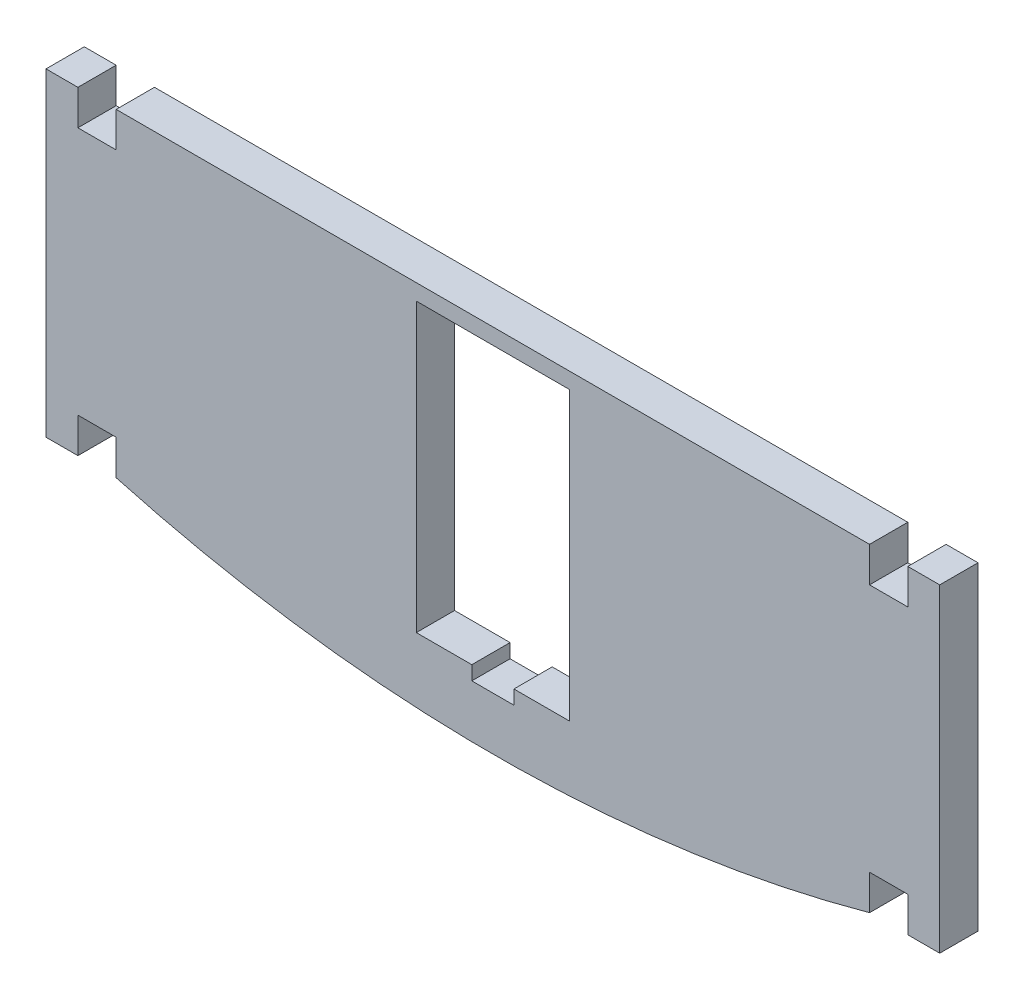
ISO-10303-21;
HEADER;
FILE_DESCRIPTION(('STEP AP214'),'2;1');
FILE_NAME('part.step','',(''),(''),'','','');
FILE_SCHEMA(('AUTOMOTIVE_DESIGN { 1 0 10303 214 1 1 1 1 }'));
ENDSEC;
DATA;
#1=APPLICATION_CONTEXT('core data for automotive mechanical design processes');
#2=APPLICATION_PROTOCOL_DEFINITION('international standard','automotive_design',2000,#1);
#3=PRODUCT_CONTEXT('',#1,'mechanical');
#4=PRODUCT('Part','Part','',(#3));
#5=PRODUCT_RELATED_PRODUCT_CATEGORY('part','',(#4));
#6=PRODUCT_DEFINITION_FORMATION('','',#4);
#7=PRODUCT_DEFINITION_CONTEXT('part definition',#1,'design');
#8=PRODUCT_DEFINITION('design','',#6,#7);
#9=PRODUCT_DEFINITION_SHAPE('','',#8);
#10=(LENGTH_UNIT() NAMED_UNIT(*) SI_UNIT(.MILLI.,.METRE.));
#11=(NAMED_UNIT(*) PLANE_ANGLE_UNIT() SI_UNIT($,.RADIAN.));
#12=(NAMED_UNIT(*) SI_UNIT($,.STERADIAN.) SOLID_ANGLE_UNIT());
#13=UNCERTAINTY_MEASURE_WITH_UNIT(LENGTH_MEASURE(1.E-05),#10,'distance_accuracy_value','');
#14=(GEOMETRIC_REPRESENTATION_CONTEXT(3) GLOBAL_UNCERTAINTY_ASSIGNED_CONTEXT((#13)) GLOBAL_UNIT_ASSIGNED_CONTEXT((#10,
#11,#12)) REPRESENTATION_CONTEXT('',''));
#15=CARTESIAN_POINT('',(0.,0.,0.));
#16=DIRECTION('',(0.,0.,1.));
#17=DIRECTION('',(1.,0.,0.));
#18=AXIS2_PLACEMENT_3D('',#15,#16,#17);
#19=CARTESIAN_POINT('',(-5.99999999999999,-11.25,-3.));
#20=DIRECTION('',(0.,1.,0.));
#21=DIRECTION('',(-1.,0.,0.));
#22=AXIS2_PLACEMENT_3D('',#19,#20,#21);
#23=PLANE('',#22);
#24=DIRECTION('',(0.,0.,1.));
#25=VECTOR('',#24,1.);
#26=CARTESIAN_POINT('',(-1.65,-11.25,-10.));
#27=LINE('',#26,#25);
#28=CARTESIAN_POINT('',(-1.65,-11.25,-3.));
#29=VERTEX_POINT('',#28);
#30=CARTESIAN_POINT('',(-1.65,-11.25,0.));
#31=VERTEX_POINT('',#30);
#32=EDGE_CURVE('E523',#29,#31,#27,.T.);
#33=ORIENTED_EDGE('',*,*,#32,.F.);
#34=DIRECTION('',(-1.,0.,0.));
#35=VECTOR('',#34,1.);
#36=CARTESIAN_POINT('',(-5.99999999999999,-11.25,-3.));
#37=LINE('',#36,#35);
#38=CARTESIAN_POINT('',(-5.99999999999999,-11.25,-3.));
#39=VERTEX_POINT('',#38);
#40=EDGE_CURVE('E60',#29,#39,#37,.T.);
#41=ORIENTED_EDGE('',*,*,#40,.T.);
#42=DIRECTION('',(0.,0.,1.));
#43=VECTOR('',#42,1.);
#44=CARTESIAN_POINT('',(-5.99999999999999,-11.25,-3.));
#45=LINE('',#44,#43);
#46=CARTESIAN_POINT('',(-5.99999999999999,-11.25,0.));
#47=VERTEX_POINT('',#46);
#48=EDGE_CURVE('E11',#39,#47,#45,.T.);
#49=ORIENTED_EDGE('',*,*,#48,.T.);
#50=DIRECTION('',(-1.,0.,0.));
#51=VECTOR('',#50,1.);
#52=CARTESIAN_POINT('',(-5.99999999999999,-11.25,0.));
#53=LINE('',#52,#51);
#54=EDGE_CURVE('E103',#31,#47,#53,.T.);
#55=ORIENTED_EDGE('',*,*,#54,.F.);
#56=EDGE_LOOP('',(#33,#41,#49,#55));
#57=FACE_BOUND('',#56,.T.);
#58=ADVANCED_FACE('F35',(#57),#23,.T.);
#59=CARTESIAN_POINT('',(-5.99999999999999,11.25,-3.));
#60=DIRECTION('',(1.,0.,0.));
#61=DIRECTION('',(0.,0.,-1.));
#62=AXIS2_PLACEMENT_3D('',#59,#60,#61);
#63=PLANE('',#62);
#64=DIRECTION('',(0.,1.,0.));
#65=VECTOR('',#64,1.);
#66=CARTESIAN_POINT('',(-5.99999999999999,11.25,0.));
#67=LINE('',#66,#65);
#68=CARTESIAN_POINT('',(-5.99999999999999,11.25,0.));
#69=VERTEX_POINT('',#68);
#70=EDGE_CURVE('E173',#47,#69,#67,.T.);
#71=ORIENTED_EDGE('',*,*,#70,.F.);
#72=ORIENTED_EDGE('',*,*,#48,.F.);
#73=DIRECTION('',(0.,1.,0.));
#74=VECTOR('',#73,1.);
#75=CARTESIAN_POINT('',(-5.99999999999999,11.25,-3.));
#76=LINE('',#75,#74);
#77=CARTESIAN_POINT('',(-5.99999999999999,11.25,-3.));
#78=VERTEX_POINT('',#77);
#79=EDGE_CURVE('E208',#39,#78,#76,.T.);
#80=ORIENTED_EDGE('',*,*,#79,.T.);
#81=DIRECTION('',(0.,0.,1.));
#82=VECTOR('',#81,1.);
#83=CARTESIAN_POINT('',(-5.99999999999999,11.25,-3.));
#84=LINE('',#83,#82);
#85=EDGE_CURVE('E39',#78,#69,#84,.T.);
#86=ORIENTED_EDGE('',*,*,#85,.T.);
#87=EDGE_LOOP('',(#71,#72,#80,#86));
#88=FACE_BOUND('',#87,.T.);
#89=ADVANCED_FACE('F37',(#88),#63,.T.);
#90=DIRECTION('',(0.,0.,1.));
#91=VECTOR('',#90,1.);
#92=CARTESIAN_POINT('',(1.65,-11.25,-10.));
#93=LINE('',#92,#91);
#94=CARTESIAN_POINT('',(1.65,-11.25,-3.));
#95=VERTEX_POINT('',#94);
#96=CARTESIAN_POINT('',(1.65,-11.25,0.));
#97=VERTEX_POINT('',#96);
#98=EDGE_CURVE('E516',#95,#97,#93,.T.);
#99=ORIENTED_EDGE('',*,*,#98,.T.);
#100=CARTESIAN_POINT('',(5.99999999999999,-11.25,0.));
#101=VERTEX_POINT('',#100);
#102=EDGE_CURVE('E206',#101,#97,#53,.T.);
#103=ORIENTED_EDGE('',*,*,#102,.F.);
#104=DIRECTION('',(0.,0.,1.));
#105=VECTOR('',#104,1.);
#106=CARTESIAN_POINT('',(5.99999999999999,-11.25,-3.));
#107=LINE('',#106,#105);
#108=CARTESIAN_POINT('',(5.99999999999999,-11.25,-3.));
#109=VERTEX_POINT('',#108);
#110=EDGE_CURVE('E320',#109,#101,#107,.T.);
#111=ORIENTED_EDGE('',*,*,#110,.F.);
#112=EDGE_CURVE('E170',#109,#95,#37,.T.);
#113=ORIENTED_EDGE('',*,*,#112,.T.);
#114=EDGE_LOOP('',(#99,#103,#111,#113));
#115=FACE_BOUND('',#114,.T.);
#116=ADVANCED_FACE('F503',(#115),#23,.T.);
#117=CARTESIAN_POINT('',(0.,94.414355190673,-3.));
#118=DIRECTION('',(0.,0.,1.));
#119=DIRECTION('',(1.,0.,0.));
#120=AXIS2_PLACEMENT_3D('',#117,#118,#119);
#121=CYLINDRICAL_SURFACE('',#120,110.914355190673);
#122=CARTESIAN_POINT('',(0.,94.414355190673,0.));
#123=DIRECTION('',(0.,0.,1.));
#124=DIRECTION('',(1.,0.,0.));
#125=AXIS2_PLACEMENT_3D('',#122,#123,#124);
#126=CIRCLE('',#125,110.914355190673);
#127=CARTESIAN_POINT('',(-29.518042643871,-12.5,0.));
#128=VERTEX_POINT('',#127);
#129=CARTESIAN_POINT('',(29.518042643871,-12.5,0.));
#130=VERTEX_POINT('',#129);
#131=EDGE_CURVE('E203',#128,#130,#126,.T.);
#132=ORIENTED_EDGE('',*,*,#131,.F.);
#133=DIRECTION('',(0.,0.,1.));
#134=VECTOR('',#133,1.);
#135=CARTESIAN_POINT('',(-29.518042643871,-12.5,-3.));
#136=LINE('',#135,#134);
#137=CARTESIAN_POINT('',(-29.518042643871,-12.5,-3.));
#138=VERTEX_POINT('',#137);
#139=EDGE_CURVE('E44',#138,#128,#136,.T.);
#140=ORIENTED_EDGE('',*,*,#139,.F.);
#141=CARTESIAN_POINT('',(0.,94.414355190673,-3.));
#142=DIRECTION('',(0.,0.,1.));
#143=DIRECTION('',(1.,0.,0.));
#144=AXIS2_PLACEMENT_3D('',#141,#142,#143);
#145=CIRCLE('',#144,110.914355190673);
#146=CARTESIAN_POINT('',(29.518042643871,-12.5,-3.));
#147=VERTEX_POINT('',#146);
#148=EDGE_CURVE('E160',#138,#147,#145,.T.);
#149=ORIENTED_EDGE('',*,*,#148,.T.);
#150=DIRECTION('',(0.,0.,1.));
#151=VECTOR('',#150,1.);
#152=CARTESIAN_POINT('',(29.518042643871,-12.5,-3.));
#153=LINE('',#152,#151);
#154=EDGE_CURVE('E313',#147,#130,#153,.T.);
#155=ORIENTED_EDGE('',*,*,#154,.T.);
#156=EDGE_LOOP('',(#132,#140,#149,#155));
#157=FACE_BOUND('',#156,.T.);
#158=ADVANCED_FACE('F319',(#157),#121,.T.);
#159=CARTESIAN_POINT('',(-29.5180426438709,-9.75,-3.));
#160=DIRECTION('',(-1.,0.,0.));
#161=DIRECTION('',(0.,-1.,0.));
#162=AXIS2_PLACEMENT_3D('',#159,#160,#161);
#163=PLANE('',#162);
#164=DIRECTION('',(0.,-1.,0.));
#165=VECTOR('',#164,1.);
#166=CARTESIAN_POINT('',(-29.5180426438709,-9.75,0.));
#167=LINE('',#166,#165);
#168=CARTESIAN_POINT('',(-29.5180426438709,-9.75,0.));
#169=VERTEX_POINT('',#168);
#170=EDGE_CURVE('E143',#169,#128,#167,.T.);
#171=ORIENTED_EDGE('',*,*,#170,.F.);
#172=DIRECTION('',(0.,0.,1.));
#173=VECTOR('',#172,1.);
#174=CARTESIAN_POINT('',(-29.5180426438709,-9.75,-3.));
#175=LINE('',#174,#173);
#176=CARTESIAN_POINT('',(-29.5180426438709,-9.75,-3.));
#177=VERTEX_POINT('',#176);
#178=EDGE_CURVE('E138',#177,#169,#175,.T.);
#179=ORIENTED_EDGE('',*,*,#178,.F.);
#180=DIRECTION('',(0.,-1.,0.));
#181=VECTOR('',#180,1.);
#182=CARTESIAN_POINT('',(-29.5180426438709,-9.75,-3.));
#183=LINE('',#182,#181);
#184=EDGE_CURVE('E141',#177,#138,#183,.T.);
#185=ORIENTED_EDGE('',*,*,#184,.T.);
#186=ORIENTED_EDGE('',*,*,#139,.T.);
#187=EDGE_LOOP('',(#171,#179,#185,#186));
#188=FACE_BOUND('',#187,.T.);
#189=ADVANCED_FACE('F140',(#188),#163,.T.);
#190=CARTESIAN_POINT('',(-32.5180426438709,-9.75,-3.));
#191=DIRECTION('',(0.,-1.,0.));
#192=DIRECTION('',(0.,0.,-1.));
#193=AXIS2_PLACEMENT_3D('',#190,#191,#192);
#194=PLANE('',#193);
#195=DIRECTION('',(1.,0.,0.));
#196=VECTOR('',#195,1.);
#197=CARTESIAN_POINT('',(-32.5180426438709,-9.75,0.));
#198=LINE('',#197,#196);
#199=CARTESIAN_POINT('',(-32.5180426438709,-9.75,0.));
#200=VERTEX_POINT('',#199);
#201=EDGE_CURVE('E200',#200,#169,#198,.T.);
#202=ORIENTED_EDGE('',*,*,#201,.F.);
#203=DIRECTION('',(0.,0.,1.));
#204=VECTOR('',#203,1.);
#205=CARTESIAN_POINT('',(-32.5180426438709,-9.75,-3.));
#206=LINE('',#205,#204);
#207=CARTESIAN_POINT('',(-32.5180426438709,-9.75,-3.));
#208=VERTEX_POINT('',#207);
#209=EDGE_CURVE('E148',#208,#200,#206,.T.);
#210=ORIENTED_EDGE('',*,*,#209,.F.);
#211=DIRECTION('',(1.,0.,0.));
#212=VECTOR('',#211,1.);
#213=CARTESIAN_POINT('',(-32.5180426438709,-9.75,-3.));
#214=LINE('',#213,#212);
#215=EDGE_CURVE('E156',#208,#177,#214,.T.);
#216=ORIENTED_EDGE('',*,*,#215,.T.);
#217=ORIENTED_EDGE('',*,*,#178,.T.);
#218=EDGE_LOOP('',(#202,#210,#216,#217));
#219=FACE_BOUND('',#218,.T.);
#220=ADVANCED_FACE('F162',(#219),#194,.T.);
#221=CARTESIAN_POINT('',(-32.5180426438709,-12.5,-3.));
#222=DIRECTION('',(1.,0.,0.));
#223=DIRECTION('',(0.,0.,-1.));
#224=AXIS2_PLACEMENT_3D('',#221,#222,#223);
#225=PLANE('',#224);
#226=DIRECTION('',(0.,1.,0.));
#227=VECTOR('',#226,1.);
#228=CARTESIAN_POINT('',(-32.5180426438709,-12.5,0.));
#229=LINE('',#228,#227);
#230=CARTESIAN_POINT('',(-32.5180426438709,-12.5,0.));
#231=VERTEX_POINT('',#230);
#232=EDGE_CURVE('E197',#231,#200,#229,.T.);
#233=ORIENTED_EDGE('',*,*,#232,.F.);
#234=DIRECTION('',(0.,0.,1.));
#235=VECTOR('',#234,1.);
#236=CARTESIAN_POINT('',(-32.5180426438709,-12.5,-3.));
#237=LINE('',#236,#235);
#238=CARTESIAN_POINT('',(-32.5180426438709,-12.5,-3.));
#239=VERTEX_POINT('',#238);
#240=EDGE_CURVE('E212',#239,#231,#237,.T.);
#241=ORIENTED_EDGE('',*,*,#240,.F.);
#242=DIRECTION('',(0.,1.,0.));
#243=VECTOR('',#242,1.);
#244=CARTESIAN_POINT('',(-32.5180426438709,-12.5,-3.));
#245=LINE('',#244,#243);
#246=EDGE_CURVE('E163',#239,#208,#245,.T.);
#247=ORIENTED_EDGE('',*,*,#246,.T.);
#248=ORIENTED_EDGE('',*,*,#209,.T.);
#249=EDGE_LOOP('',(#233,#241,#247,#248));
#250=FACE_BOUND('',#249,.T.);
#251=ADVANCED_FACE('F295',(#250),#225,.T.);
#252=CARTESIAN_POINT('',(-35.0180426438709,-12.5,-3.));
#253=DIRECTION('',(0.,-1.,0.));
#254=DIRECTION('',(0.,0.,-1.));
#255=AXIS2_PLACEMENT_3D('',#252,#253,#254);
#256=PLANE('',#255);
#257=DIRECTION('',(1.,0.,0.));
#258=VECTOR('',#257,1.);
#259=CARTESIAN_POINT('',(-35.0180426438709,-12.5,0.));
#260=LINE('',#259,#258);
#261=CARTESIAN_POINT('',(-35.0180426438709,-12.5,0.));
#262=VERTEX_POINT('',#261);
#263=EDGE_CURVE('E194',#262,#231,#260,.T.);
#264=ORIENTED_EDGE('',*,*,#263,.F.);
#265=DIRECTION('',(0.,0.,1.));
#266=VECTOR('',#265,1.);
#267=CARTESIAN_POINT('',(-35.0180426438709,-12.5,-3.));
#268=LINE('',#267,#266);
#269=CARTESIAN_POINT('',(-35.0180426438709,-12.5,-3.));
#270=VERTEX_POINT('',#269);
#271=EDGE_CURVE('E214',#270,#262,#268,.T.);
#272=ORIENTED_EDGE('',*,*,#271,.F.);
#273=DIRECTION('',(1.,0.,0.));
#274=VECTOR('',#273,1.);
#275=CARTESIAN_POINT('',(-35.0180426438709,-12.5,-3.));
#276=LINE('',#275,#274);
#277=EDGE_CURVE('E165',#270,#239,#276,.T.);
#278=ORIENTED_EDGE('',*,*,#277,.T.);
#279=ORIENTED_EDGE('',*,*,#240,.T.);
#280=EDGE_LOOP('',(#264,#272,#278,#279));
#281=FACE_BOUND('',#280,.T.);
#282=ADVANCED_FACE('F291',(#281),#256,.T.);
#283=CARTESIAN_POINT('',(-35.0180426438709,12.5,-3.));
#284=DIRECTION('',(-1.,0.,0.));
#285=DIRECTION('',(0.,0.,1.));
#286=AXIS2_PLACEMENT_3D('',#283,#284,#285);
#287=PLANE('',#286);
#288=DIRECTION('',(0.,-1.,0.));
#289=VECTOR('',#288,1.);
#290=CARTESIAN_POINT('',(-35.0180426438709,12.5,0.));
#291=LINE('',#290,#289);
#292=CARTESIAN_POINT('',(-35.0180426438709,12.5,0.));
#293=VERTEX_POINT('',#292);
#294=EDGE_CURVE('E191',#293,#262,#291,.T.);
#295=ORIENTED_EDGE('',*,*,#294,.F.);
#296=DIRECTION('',(0.,0.,1.));
#297=VECTOR('',#296,1.);
#298=CARTESIAN_POINT('',(-35.0180426438709,12.5,-3.));
#299=LINE('',#298,#297);
#300=CARTESIAN_POINT('',(-35.0180426438709,12.5,-3.));
#301=VERTEX_POINT('',#300);
#302=EDGE_CURVE('E216',#301,#293,#299,.T.);
#303=ORIENTED_EDGE('',*,*,#302,.F.);
#304=DIRECTION('',(0.,-1.,0.));
#305=VECTOR('',#304,1.);
#306=CARTESIAN_POINT('',(-35.0180426438709,12.5,-3.));
#307=LINE('',#306,#305);
#308=EDGE_CURVE('E337',#301,#270,#307,.T.);
#309=ORIENTED_EDGE('',*,*,#308,.T.);
#310=ORIENTED_EDGE('',*,*,#271,.T.);
#311=EDGE_LOOP('',(#295,#303,#309,#310));
#312=FACE_BOUND('',#311,.T.);
#313=ADVANCED_FACE('F287',(#312),#287,.T.);
#314=CARTESIAN_POINT('',(-32.5180426438709,12.5,-3.));
#315=DIRECTION('',(0.,1.,0.));
#316=DIRECTION('',(0.,0.,1.));
#317=AXIS2_PLACEMENT_3D('',#314,#315,#316);
#318=PLANE('',#317);
#319=DIRECTION('',(-1.,0.,0.));
#320=VECTOR('',#319,1.);
#321=CARTESIAN_POINT('',(-32.5180426438709,12.5,0.));
#322=LINE('',#321,#320);
#323=CARTESIAN_POINT('',(-32.5180426438709,12.5,0.));
#324=VERTEX_POINT('',#323);
#325=EDGE_CURVE('E188',#324,#293,#322,.T.);
#326=ORIENTED_EDGE('',*,*,#325,.F.);
#327=DIRECTION('',(0.,0.,1.));
#328=VECTOR('',#327,1.);
#329=CARTESIAN_POINT('',(-32.5180426438709,12.5,-3.));
#330=LINE('',#329,#328);
#331=CARTESIAN_POINT('',(-32.5180426438709,12.5,-3.));
#332=VERTEX_POINT('',#331);
#333=EDGE_CURVE('E218',#332,#324,#330,.T.);
#334=ORIENTED_EDGE('',*,*,#333,.F.);
#335=DIRECTION('',(-1.,0.,0.));
#336=VECTOR('',#335,1.);
#337=CARTESIAN_POINT('',(-32.5180426438709,12.5,-3.));
#338=LINE('',#337,#336);
#339=EDGE_CURVE('E283',#332,#301,#338,.T.);
#340=ORIENTED_EDGE('',*,*,#339,.T.);
#341=ORIENTED_EDGE('',*,*,#302,.T.);
#342=EDGE_LOOP('',(#326,#334,#340,#341));
#343=FACE_BOUND('',#342,.T.);
#344=ADVANCED_FACE('F281',(#343),#318,.T.);
#345=CARTESIAN_POINT('',(-32.5180426438709,9.75,-3.));
#346=DIRECTION('',(1.,0.,0.));
#347=DIRECTION('',(0.,0.,-1.));
#348=AXIS2_PLACEMENT_3D('',#345,#346,#347);
#349=PLANE('',#348);
#350=DIRECTION('',(0.,1.,0.));
#351=VECTOR('',#350,1.);
#352=CARTESIAN_POINT('',(-32.5180426438709,9.75,0.));
#353=LINE('',#352,#351);
#354=CARTESIAN_POINT('',(-32.5180426438709,9.75,0.));
#355=VERTEX_POINT('',#354);
#356=EDGE_CURVE('E185',#355,#324,#353,.T.);
#357=ORIENTED_EDGE('',*,*,#356,.F.);
#358=DIRECTION('',(0.,0.,1.));
#359=VECTOR('',#358,1.);
#360=CARTESIAN_POINT('',(-32.5180426438709,9.75,-3.));
#361=LINE('',#360,#359);
#362=CARTESIAN_POINT('',(-32.5180426438709,9.75,-3.));
#363=VERTEX_POINT('',#362);
#364=EDGE_CURVE('E220',#363,#355,#361,.T.);
#365=ORIENTED_EDGE('',*,*,#364,.F.);
#366=DIRECTION('',(0.,1.,0.));
#367=VECTOR('',#366,1.);
#368=CARTESIAN_POINT('',(-32.5180426438709,9.75,-3.));
#369=LINE('',#368,#367);
#370=EDGE_CURVE('E277',#363,#332,#369,.T.);
#371=ORIENTED_EDGE('',*,*,#370,.T.);
#372=ORIENTED_EDGE('',*,*,#333,.T.);
#373=EDGE_LOOP('',(#357,#365,#371,#372));
#374=FACE_BOUND('',#373,.T.);
#375=ADVANCED_FACE('F274',(#374),#349,.T.);
#376=CARTESIAN_POINT('',(-29.5180426438709,9.75,-3.));
#377=DIRECTION('',(0.,1.,0.));
#378=DIRECTION('',(0.,0.,1.));
#379=AXIS2_PLACEMENT_3D('',#376,#377,#378);
#380=PLANE('',#379);
#381=DIRECTION('',(-1.,0.,0.));
#382=VECTOR('',#381,1.);
#383=CARTESIAN_POINT('',(-29.5180426438709,9.75,0.));
#384=LINE('',#383,#382);
#385=CARTESIAN_POINT('',(-29.5180426438709,9.75,0.));
#386=VERTEX_POINT('',#385);
#387=EDGE_CURVE('E182',#386,#355,#384,.T.);
#388=ORIENTED_EDGE('',*,*,#387,.F.);
#389=DIRECTION('',(0.,0.,1.));
#390=VECTOR('',#389,1.);
#391=CARTESIAN_POINT('',(-29.5180426438709,9.75,-3.));
#392=LINE('',#391,#390);
#393=CARTESIAN_POINT('',(-29.5180426438709,9.75,-3.));
#394=VERTEX_POINT('',#393);
#395=EDGE_CURVE('E222',#394,#386,#392,.T.);
#396=ORIENTED_EDGE('',*,*,#395,.F.);
#397=DIRECTION('',(-1.,0.,0.));
#398=VECTOR('',#397,1.);
#399=CARTESIAN_POINT('',(-29.5180426438709,9.75,-3.));
#400=LINE('',#399,#398);
#401=EDGE_CURVE('E333',#394,#363,#400,.T.);
#402=ORIENTED_EDGE('',*,*,#401,.T.);
#403=ORIENTED_EDGE('',*,*,#364,.T.);
#404=EDGE_LOOP('',(#388,#396,#402,#403));
#405=FACE_BOUND('',#404,.T.);
#406=ADVANCED_FACE('F270',(#405),#380,.T.);
#407=CARTESIAN_POINT('',(-29.5180426438709,12.5,-3.));
#408=DIRECTION('',(-1.,0.,0.));
#409=DIRECTION('',(0.,-1.,0.));
#410=AXIS2_PLACEMENT_3D('',#407,#408,#409);
#411=PLANE('',#410);
#412=DIRECTION('',(0.,-1.,0.));
#413=VECTOR('',#412,1.);
#414=CARTESIAN_POINT('',(-29.5180426438709,12.5,0.));
#415=LINE('',#414,#413);
#416=CARTESIAN_POINT('',(-29.5180426438709,12.5,0.));
#417=VERTEX_POINT('',#416);
#418=EDGE_CURVE('E179',#417,#386,#415,.T.);
#419=ORIENTED_EDGE('',*,*,#418,.F.);
#420=DIRECTION('',(0.,0.,1.));
#421=VECTOR('',#420,1.);
#422=CARTESIAN_POINT('',(-29.5180426438709,12.5,-3.));
#423=LINE('',#422,#421);
#424=CARTESIAN_POINT('',(-29.5180426438709,12.5,-3.));
#425=VERTEX_POINT('',#424);
#426=EDGE_CURVE('E223',#425,#417,#423,.T.);
#427=ORIENTED_EDGE('',*,*,#426,.F.);
#428=DIRECTION('',(0.,-1.,0.));
#429=VECTOR('',#428,1.);
#430=CARTESIAN_POINT('',(-29.5180426438709,12.5,-3.));
#431=LINE('',#430,#429);
#432=EDGE_CURVE('E266',#425,#394,#431,.T.);
#433=ORIENTED_EDGE('',*,*,#432,.T.);
#434=ORIENTED_EDGE('',*,*,#395,.T.);
#435=EDGE_LOOP('',(#419,#427,#433,#434));
#436=FACE_BOUND('',#435,.T.);
#437=ADVANCED_FACE('F263',(#436),#411,.T.);
#438=CARTESIAN_POINT('',(-5.99999999999999,11.25,-3.));
#439=DIRECTION('',(0.,-1.,0.));
#440=DIRECTION('',(1.,0.,0.));
#441=AXIS2_PLACEMENT_3D('',#438,#439,#440);
#442=PLANE('',#441);
#443=DIRECTION('',(1.,0.,0.));
#444=VECTOR('',#443,1.);
#445=CARTESIAN_POINT('',(-5.99999999999999,11.25,0.));
#446=LINE('',#445,#444);
#447=CARTESIAN_POINT('',(5.99999999999999,11.25,0.));
#448=VERTEX_POINT('',#447);
#449=EDGE_CURVE('E175',#69,#448,#446,.T.);
#450=ORIENTED_EDGE('',*,*,#449,.F.);
#451=ORIENTED_EDGE('',*,*,#85,.F.);
#452=DIRECTION('',(1.,0.,0.));
#453=VECTOR('',#452,1.);
#454=CARTESIAN_POINT('',(-5.99999999999999,11.25,-3.));
#455=LINE('',#454,#453);
#456=CARTESIAN_POINT('',(5.99999999999999,11.25,-3.));
#457=VERTEX_POINT('',#456);
#458=EDGE_CURVE('E330',#78,#457,#455,.T.);
#459=ORIENTED_EDGE('',*,*,#458,.T.);
#460=DIRECTION('',(0.,0.,1.));
#461=VECTOR('',#460,1.);
#462=CARTESIAN_POINT('',(5.99999999999999,11.25,-3.));
#463=LINE('',#462,#461);
#464=EDGE_CURVE('E176',#457,#448,#463,.T.);
#465=ORIENTED_EDGE('',*,*,#464,.T.);
#466=EDGE_LOOP('',(#450,#451,#459,#465));
#467=FACE_BOUND('',#466,.T.);
#468=ADVANCED_FACE('F236',(#467),#442,.T.);
#469=CARTESIAN_POINT('',(0.,94.414355190673,-3.));
#470=DIRECTION('',(0.,0.,1.));
#471=DIRECTION('',(1.,0.,0.));
#472=AXIS2_PLACEMENT_3D('',#469,#470,#471);
#473=PLANE('',#472);
#474=ORIENTED_EDGE('',*,*,#40,.F.);
#475=DIRECTION('',(0.,-1.,0.));
#476=VECTOR('',#475,1.);
#477=CARTESIAN_POINT('',(-1.65000000000004,94.414355190673,-3.));
#478=LINE('',#477,#476);
#479=CARTESIAN_POINT('',(-1.65,-12.35,-3.));
#480=VERTEX_POINT('',#479);
#481=EDGE_CURVE('E260',#29,#480,#478,.T.);
#482=ORIENTED_EDGE('',*,*,#481,.T.);
#483=DIRECTION('',(1.,0.,0.));
#484=VECTOR('',#483,1.);
#485=CARTESIAN_POINT('',(0.,-12.35,-3.));
#486=LINE('',#485,#484);
#487=CARTESIAN_POINT('',(1.65,-12.35,-3.));
#488=VERTEX_POINT('',#487);
#489=EDGE_CURVE('E538',#480,#488,#486,.T.);
#490=ORIENTED_EDGE('',*,*,#489,.T.);
#491=DIRECTION('',(0.,1.,0.));
#492=VECTOR('',#491,1.);
#493=CARTESIAN_POINT('',(1.65,94.414355190673,-3.));
#494=LINE('',#493,#492);
#495=EDGE_CURVE('E543',#488,#95,#494,.T.);
#496=ORIENTED_EDGE('',*,*,#495,.T.);
#497=ORIENTED_EDGE('',*,*,#112,.F.);
#498=DIRECTION('',(0.,1.,0.));
#499=VECTOR('',#498,1.);
#500=CARTESIAN_POINT('',(5.99999999999999,11.25,-3.));
#501=LINE('',#500,#499);
#502=EDGE_CURVE('E404',#109,#457,#501,.T.);
#503=ORIENTED_EDGE('',*,*,#502,.T.);
#504=ORIENTED_EDGE('',*,*,#458,.F.);
#505=ORIENTED_EDGE('',*,*,#79,.F.);
#506=EDGE_LOOP('',(#474,#482,#490,#496,#497,#503,#504,#505));
#507=FACE_BOUND('',#506,.T.);
#508=ORIENTED_EDGE('',*,*,#432,.F.);
#509=DIRECTION('',(1.,0.,0.));
#510=VECTOR('',#509,1.);
#511=CARTESIAN_POINT('',(0.,12.5,-3.));
#512=LINE('',#511,#510);
#513=CARTESIAN_POINT('',(29.5180426438709,12.5,-3.));
#514=VERTEX_POINT('',#513);
#515=EDGE_CURVE('E259',#425,#514,#512,.T.);
#516=ORIENTED_EDGE('',*,*,#515,.T.);
#517=DIRECTION('',(0.,-1.,0.));
#518=VECTOR('',#517,1.);
#519=CARTESIAN_POINT('',(29.5180426438709,12.5,-3.));
#520=LINE('',#519,#518);
#521=CARTESIAN_POINT('',(29.5180426438709,9.75,-3.));
#522=VERTEX_POINT('',#521);
#523=EDGE_CURVE('E325',#514,#522,#520,.T.);
#524=ORIENTED_EDGE('',*,*,#523,.T.);
#525=DIRECTION('',(1.,0.,0.));
#526=VECTOR('',#525,1.);
#527=CARTESIAN_POINT('',(29.5180426438709,9.75,-3.));
#528=LINE('',#527,#526);
#529=CARTESIAN_POINT('',(32.5180426438709,9.75,-3.));
#530=VERTEX_POINT('',#529);
#531=EDGE_CURVE('E411',#522,#530,#528,.T.);
#532=ORIENTED_EDGE('',*,*,#531,.T.);
#533=DIRECTION('',(0.,1.,0.));
#534=VECTOR('',#533,1.);
#535=CARTESIAN_POINT('',(32.5180426438709,9.75,-3.));
#536=LINE('',#535,#534);
#537=CARTESIAN_POINT('',(32.5180426438709,12.5,-3.));
#538=VERTEX_POINT('',#537);
#539=EDGE_CURVE('E481',#530,#538,#536,.T.);
#540=ORIENTED_EDGE('',*,*,#539,.T.);
#541=DIRECTION('',(1.,0.,0.));
#542=VECTOR('',#541,1.);
#543=CARTESIAN_POINT('',(32.5180426438709,12.5,-3.));
#544=LINE('',#543,#542);
#545=CARTESIAN_POINT('',(35.0180426438709,12.5,-3.));
#546=VERTEX_POINT('',#545);
#547=EDGE_CURVE('E479',#538,#546,#544,.T.);
#548=ORIENTED_EDGE('',*,*,#547,.T.);
#549=DIRECTION('',(0.,-1.,0.));
#550=VECTOR('',#549,1.);
#551=CARTESIAN_POINT('',(35.0180426438709,12.5,-3.));
#552=LINE('',#551,#550);
#553=CARTESIAN_POINT('',(35.0180426438709,-12.5,-3.));
#554=VERTEX_POINT('',#553);
#555=EDGE_CURVE('E464',#546,#554,#552,.T.);
#556=ORIENTED_EDGE('',*,*,#555,.T.);
#557=DIRECTION('',(-1.,0.,0.));
#558=VECTOR('',#557,1.);
#559=CARTESIAN_POINT('',(35.0180426438709,-12.5,-3.));
#560=LINE('',#559,#558);
#561=CARTESIAN_POINT('',(32.5180426438709,-12.5,-3.));
#562=VERTEX_POINT('',#561);
#563=EDGE_CURVE('E471',#554,#562,#560,.T.);
#564=ORIENTED_EDGE('',*,*,#563,.T.);
#565=DIRECTION('',(0.,1.,0.));
#566=VECTOR('',#565,1.);
#567=CARTESIAN_POINT('',(32.5180426438709,-12.5,-3.));
#568=LINE('',#567,#566);
#569=CARTESIAN_POINT('',(32.5180426438709,-9.75,-3.));
#570=VERTEX_POINT('',#569);
#571=EDGE_CURVE('E470',#562,#570,#568,.T.);
#572=ORIENTED_EDGE('',*,*,#571,.T.);
#573=DIRECTION('',(-1.,0.,0.));
#574=VECTOR('',#573,1.);
#575=CARTESIAN_POINT('',(32.5180426438709,-9.75,-3.));
#576=LINE('',#575,#574);
#577=CARTESIAN_POINT('',(29.5180426438709,-9.75,-3.));
#578=VERTEX_POINT('',#577);
#579=EDGE_CURVE('E441',#570,#578,#576,.T.);
#580=ORIENTED_EDGE('',*,*,#579,.T.);
#581=DIRECTION('',(0.,-1.,0.));
#582=VECTOR('',#581,1.);
#583=CARTESIAN_POINT('',(29.5180426438709,-9.75,-3.));
#584=LINE('',#583,#582);
#585=EDGE_CURVE('E474',#578,#147,#584,.T.);
#586=ORIENTED_EDGE('',*,*,#585,.T.);
#587=ORIENTED_EDGE('',*,*,#148,.F.);
#588=ORIENTED_EDGE('',*,*,#184,.F.);
#589=ORIENTED_EDGE('',*,*,#215,.F.);
#590=ORIENTED_EDGE('',*,*,#246,.F.);
#591=ORIENTED_EDGE('',*,*,#277,.F.);
#592=ORIENTED_EDGE('',*,*,#308,.F.);
#593=ORIENTED_EDGE('',*,*,#339,.F.);
#594=ORIENTED_EDGE('',*,*,#370,.F.);
#595=ORIENTED_EDGE('',*,*,#401,.F.);
#596=EDGE_LOOP('',(#508,#516,#524,#532,#540,#548,#556,#564,#572,#580,#586,#587,#588,#589,#590,
#591,#592,#593,#594,#595));
#597=FACE_BOUND('',#596,.T.);
#598=ADVANCED_FACE('F154',(#507,#597),#473,.F.);
#599=CARTESIAN_POINT('',(0.,94.414355190673,0.));
#600=DIRECTION('',(0.,0.,1.));
#601=DIRECTION('',(1.,0.,0.));
#602=AXIS2_PLACEMENT_3D('',#599,#600,#601);
#603=PLANE('',#602);
#604=DIRECTION('',(0.,-1.,0.));
#605=VECTOR('',#604,1.);
#606=CARTESIAN_POINT('',(-1.65,-11.25,0.));
#607=LINE('',#606,#605);
#608=CARTESIAN_POINT('',(-1.65,-12.35,0.));
#609=VERTEX_POINT('',#608);
#610=EDGE_CURVE('E52',#31,#609,#607,.T.);
#611=ORIENTED_EDGE('',*,*,#610,.F.);
#612=ORIENTED_EDGE('',*,*,#54,.T.);
#613=ORIENTED_EDGE('',*,*,#70,.T.);
#614=ORIENTED_EDGE('',*,*,#449,.T.);
#615=DIRECTION('',(0.,1.,0.));
#616=VECTOR('',#615,1.);
#617=CARTESIAN_POINT('',(5.99999999999999,11.25,0.));
#618=LINE('',#617,#616);
#619=EDGE_CURVE('E317',#101,#448,#618,.T.);
#620=ORIENTED_EDGE('',*,*,#619,.F.);
#621=ORIENTED_EDGE('',*,*,#102,.T.);
#622=DIRECTION('',(0.,1.,0.));
#623=VECTOR('',#622,1.);
#624=CARTESIAN_POINT('',(1.65,-11.25,0.));
#625=LINE('',#624,#623);
#626=CARTESIAN_POINT('',(1.65,-12.35,0.));
#627=VERTEX_POINT('',#626);
#628=EDGE_CURVE('E527',#627,#97,#625,.T.);
#629=ORIENTED_EDGE('',*,*,#628,.F.);
#630=DIRECTION('',(1.,0.,0.));
#631=VECTOR('',#630,1.);
#632=CARTESIAN_POINT('',(-1.65,-12.35,0.));
#633=LINE('',#632,#631);
#634=EDGE_CURVE('E529',#609,#627,#633,.T.);
#635=ORIENTED_EDGE('',*,*,#634,.F.);
#636=EDGE_LOOP('',(#611,#612,#613,#614,#620,#621,#629,#635));
#637=FACE_BOUND('',#636,.T.);
#638=DIRECTION('',(1.,0.,0.));
#639=VECTOR('',#638,1.);
#640=CARTESIAN_POINT('',(0.,12.5,0.));
#641=LINE('',#640,#639);
#642=CARTESIAN_POINT('',(29.5180426438709,12.5,0.));
#643=VERTEX_POINT('',#642);
#644=EDGE_CURVE('E248',#417,#643,#641,.T.);
#645=ORIENTED_EDGE('',*,*,#644,.F.);
#646=ORIENTED_EDGE('',*,*,#418,.T.);
#647=ORIENTED_EDGE('',*,*,#387,.T.);
#648=ORIENTED_EDGE('',*,*,#356,.T.);
#649=ORIENTED_EDGE('',*,*,#325,.T.);
#650=ORIENTED_EDGE('',*,*,#294,.T.);
#651=ORIENTED_EDGE('',*,*,#263,.T.);
#652=ORIENTED_EDGE('',*,*,#232,.T.);
#653=ORIENTED_EDGE('',*,*,#201,.T.);
#654=ORIENTED_EDGE('',*,*,#170,.T.);
#655=ORIENTED_EDGE('',*,*,#131,.T.);
#656=DIRECTION('',(0.,-1.,0.));
#657=VECTOR('',#656,1.);
#658=CARTESIAN_POINT('',(29.5180426438709,-9.75,0.));
#659=LINE('',#658,#657);
#660=CARTESIAN_POINT('',(29.5180426438709,-9.75,0.));
#661=VERTEX_POINT('',#660);
#662=EDGE_CURVE('E302',#661,#130,#659,.T.);
#663=ORIENTED_EDGE('',*,*,#662,.F.);
#664=DIRECTION('',(-1.,0.,0.));
#665=VECTOR('',#664,1.);
#666=CARTESIAN_POINT('',(32.5180426438709,-9.75,0.));
#667=LINE('',#666,#665);
#668=CARTESIAN_POINT('',(32.5180426438709,-9.75,0.));
#669=VERTEX_POINT('',#668);
#670=EDGE_CURVE('E316',#669,#661,#667,.T.);
#671=ORIENTED_EDGE('',*,*,#670,.F.);
#672=DIRECTION('',(0.,1.,0.));
#673=VECTOR('',#672,1.);
#674=CARTESIAN_POINT('',(32.5180426438709,-12.5,0.));
#675=LINE('',#674,#673);
#676=CARTESIAN_POINT('',(32.5180426438709,-12.5,0.));
#677=VERTEX_POINT('',#676);
#678=EDGE_CURVE('E446',#677,#669,#675,.T.);
#679=ORIENTED_EDGE('',*,*,#678,.F.);
#680=DIRECTION('',(-1.,0.,0.));
#681=VECTOR('',#680,1.);
#682=CARTESIAN_POINT('',(35.0180426438709,-12.5,0.));
#683=LINE('',#682,#681);
#684=CARTESIAN_POINT('',(35.0180426438709,-12.5,0.));
#685=VERTEX_POINT('',#684);
#686=EDGE_CURVE('E448',#685,#677,#683,.T.);
#687=ORIENTED_EDGE('',*,*,#686,.F.);
#688=DIRECTION('',(0.,-1.,0.));
#689=VECTOR('',#688,1.);
#690=CARTESIAN_POINT('',(35.0180426438709,12.5,0.));
#691=LINE('',#690,#689);
#692=CARTESIAN_POINT('',(35.0180426438709,12.5,0.));
#693=VERTEX_POINT('',#692);
#694=EDGE_CURVE('E453',#693,#685,#691,.T.);
#695=ORIENTED_EDGE('',*,*,#694,.F.);
#696=DIRECTION('',(1.,0.,0.));
#697=VECTOR('',#696,1.);
#698=CARTESIAN_POINT('',(32.5180426438709,12.5,0.));
#699=LINE('',#698,#697);
#700=CARTESIAN_POINT('',(32.5180426438709,12.5,0.));
#701=VERTEX_POINT('',#700);
#702=EDGE_CURVE('E418',#701,#693,#699,.T.);
#703=ORIENTED_EDGE('',*,*,#702,.F.);
#704=DIRECTION('',(0.,1.,0.));
#705=VECTOR('',#704,1.);
#706=CARTESIAN_POINT('',(32.5180426438709,9.75,0.));
#707=LINE('',#706,#705);
#708=CARTESIAN_POINT('',(32.5180426438709,9.75,0.));
#709=VERTEX_POINT('',#708);
#710=EDGE_CURVE('E416',#709,#701,#707,.T.);
#711=ORIENTED_EDGE('',*,*,#710,.F.);
#712=DIRECTION('',(1.,0.,0.));
#713=VECTOR('',#712,1.);
#714=CARTESIAN_POINT('',(29.5180426438709,9.75,0.));
#715=LINE('',#714,#713);
#716=CARTESIAN_POINT('',(29.5180426438709,9.75,0.));
#717=VERTEX_POINT('',#716);
#718=EDGE_CURVE('E405',#717,#709,#715,.T.);
#719=ORIENTED_EDGE('',*,*,#718,.F.);
#720=DIRECTION('',(0.,-1.,0.));
#721=VECTOR('',#720,1.);
#722=CARTESIAN_POINT('',(29.5180426438709,12.5,0.));
#723=LINE('',#722,#721);
#724=EDGE_CURVE('E253',#643,#717,#723,.T.);
#725=ORIENTED_EDGE('',*,*,#724,.F.);
#726=EDGE_LOOP('',(#645,#646,#647,#648,#649,#650,#651,#652,#653,#654,#655,#663,#671,#679,#687,
#695,#703,#711,#719,#725));
#727=FACE_BOUND('',#726,.T.);
#728=ADVANCED_FACE('F240',(#637,#727),#603,.T.);
#729=CARTESIAN_POINT('',(5.99999999999999,11.25,-3.));
#730=DIRECTION('',(1.,0.,0.));
#731=DIRECTION('',(0.,0.,-1.));
#732=AXIS2_PLACEMENT_3D('',#729,#730,#731);
#733=PLANE('',#732);
#734=ORIENTED_EDGE('',*,*,#619,.T.);
#735=ORIENTED_EDGE('',*,*,#464,.F.);
#736=ORIENTED_EDGE('',*,*,#502,.F.);
#737=ORIENTED_EDGE('',*,*,#110,.T.);
#738=EDGE_LOOP('',(#734,#735,#736,#737));
#739=FACE_BOUND('',#738,.T.);
#740=ADVANCED_FACE('F245',(#739),#733,.F.);
#741=CARTESIAN_POINT('',(29.5180426438709,12.5,-3.));
#742=DIRECTION('',(-1.,0.,0.));
#743=DIRECTION('',(0.,-1.,0.));
#744=AXIS2_PLACEMENT_3D('',#741,#742,#743);
#745=PLANE('',#744);
#746=ORIENTED_EDGE('',*,*,#724,.T.);
#747=DIRECTION('',(0.,0.,1.));
#748=VECTOR('',#747,1.);
#749=CARTESIAN_POINT('',(29.5180426438709,9.75,-3.));
#750=LINE('',#749,#748);
#751=EDGE_CURVE('E401',#522,#717,#750,.T.);
#752=ORIENTED_EDGE('',*,*,#751,.F.);
#753=ORIENTED_EDGE('',*,*,#523,.F.);
#754=DIRECTION('',(0.,0.,1.));
#755=VECTOR('',#754,1.);
#756=CARTESIAN_POINT('',(29.5180426438709,12.5,-3.));
#757=LINE('',#756,#755);
#758=EDGE_CURVE('E403',#514,#643,#757,.T.);
#759=ORIENTED_EDGE('',*,*,#758,.T.);
#760=EDGE_LOOP('',(#746,#752,#753,#759));
#761=FACE_BOUND('',#760,.T.);
#762=ADVANCED_FACE('F400',(#761),#745,.F.);
#763=CARTESIAN_POINT('',(29.5180426438709,9.75,-3.));
#764=DIRECTION('',(0.,-1.,0.));
#765=DIRECTION('',(0.,0.,-1.));
#766=AXIS2_PLACEMENT_3D('',#763,#764,#765);
#767=PLANE('',#766);
#768=ORIENTED_EDGE('',*,*,#718,.T.);
#769=DIRECTION('',(0.,0.,1.));
#770=VECTOR('',#769,1.);
#771=CARTESIAN_POINT('',(32.5180426438709,9.75,-3.));
#772=LINE('',#771,#770);
#773=EDGE_CURVE('E412',#530,#709,#772,.T.);
#774=ORIENTED_EDGE('',*,*,#773,.F.);
#775=ORIENTED_EDGE('',*,*,#531,.F.);
#776=ORIENTED_EDGE('',*,*,#751,.T.);
#777=EDGE_LOOP('',(#768,#774,#775,#776));
#778=FACE_BOUND('',#777,.T.);
#779=ADVANCED_FACE('F408',(#778),#767,.F.);
#780=CARTESIAN_POINT('',(32.5180426438709,9.75,-3.));
#781=DIRECTION('',(1.,0.,0.));
#782=DIRECTION('',(0.,0.,-1.));
#783=AXIS2_PLACEMENT_3D('',#780,#781,#782);
#784=PLANE('',#783);
#785=ORIENTED_EDGE('',*,*,#710,.T.);
#786=DIRECTION('',(0.,0.,1.));
#787=VECTOR('',#786,1.);
#788=CARTESIAN_POINT('',(32.5180426438709,12.5,-3.));
#789=LINE('',#788,#787);
#790=EDGE_CURVE('E425',#538,#701,#789,.T.);
#791=ORIENTED_EDGE('',*,*,#790,.F.);
#792=ORIENTED_EDGE('',*,*,#539,.F.);
#793=ORIENTED_EDGE('',*,*,#773,.T.);
#794=EDGE_LOOP('',(#785,#791,#792,#793));
#795=FACE_BOUND('',#794,.T.);
#796=ADVANCED_FACE('F572',(#795),#784,.F.);
#797=CARTESIAN_POINT('',(32.5180426438709,12.5,-3.));
#798=DIRECTION('',(0.,-1.,0.));
#799=DIRECTION('',(0.,0.,-1.));
#800=AXIS2_PLACEMENT_3D('',#797,#798,#799);
#801=PLANE('',#800);
#802=ORIENTED_EDGE('',*,*,#702,.T.);
#803=DIRECTION('',(0.,0.,1.));
#804=VECTOR('',#803,1.);
#805=CARTESIAN_POINT('',(35.0180426438709,12.5,-3.));
#806=LINE('',#805,#804);
#807=EDGE_CURVE('E428',#546,#693,#806,.T.);
#808=ORIENTED_EDGE('',*,*,#807,.F.);
#809=ORIENTED_EDGE('',*,*,#547,.F.);
#810=ORIENTED_EDGE('',*,*,#790,.T.);
#811=EDGE_LOOP('',(#802,#808,#809,#810));
#812=FACE_BOUND('',#811,.T.);
#813=ADVANCED_FACE('F456',(#812),#801,.F.);
#814=CARTESIAN_POINT('',(35.0180426438709,12.5,-3.));
#815=DIRECTION('',(-1.,0.,0.));
#816=DIRECTION('',(0.,0.,1.));
#817=AXIS2_PLACEMENT_3D('',#814,#815,#816);
#818=PLANE('',#817);
#819=ORIENTED_EDGE('',*,*,#694,.T.);
#820=DIRECTION('',(0.,0.,1.));
#821=VECTOR('',#820,1.);
#822=CARTESIAN_POINT('',(35.0180426438709,-12.5,-3.));
#823=LINE('',#822,#821);
#824=EDGE_CURVE('E431',#554,#685,#823,.T.);
#825=ORIENTED_EDGE('',*,*,#824,.F.);
#826=ORIENTED_EDGE('',*,*,#555,.F.);
#827=ORIENTED_EDGE('',*,*,#807,.T.);
#828=EDGE_LOOP('',(#819,#825,#826,#827));
#829=FACE_BOUND('',#828,.T.);
#830=ADVANCED_FACE('F462',(#829),#818,.F.);
#831=CARTESIAN_POINT('',(35.0180426438709,-12.5,-3.));
#832=DIRECTION('',(0.,1.,0.));
#833=DIRECTION('',(0.,0.,1.));
#834=AXIS2_PLACEMENT_3D('',#831,#832,#833);
#835=PLANE('',#834);
#836=ORIENTED_EDGE('',*,*,#686,.T.);
#837=DIRECTION('',(0.,0.,1.));
#838=VECTOR('',#837,1.);
#839=CARTESIAN_POINT('',(32.5180426438709,-12.5,-3.));
#840=LINE('',#839,#838);
#841=EDGE_CURVE('E434',#562,#677,#840,.T.);
#842=ORIENTED_EDGE('',*,*,#841,.F.);
#843=ORIENTED_EDGE('',*,*,#563,.F.);
#844=ORIENTED_EDGE('',*,*,#824,.T.);
#845=EDGE_LOOP('',(#836,#842,#843,#844));
#846=FACE_BOUND('',#845,.T.);
#847=ADVANCED_FACE('F467',(#846),#835,.F.);
#848=CARTESIAN_POINT('',(32.5180426438709,-12.5,-3.));
#849=DIRECTION('',(1.,0.,0.));
#850=DIRECTION('',(0.,0.,-1.));
#851=AXIS2_PLACEMENT_3D('',#848,#849,#850);
#852=PLANE('',#851);
#853=ORIENTED_EDGE('',*,*,#678,.T.);
#854=DIRECTION('',(0.,0.,1.));
#855=VECTOR('',#854,1.);
#856=CARTESIAN_POINT('',(32.5180426438709,-9.75,-3.));
#857=LINE('',#856,#855);
#858=EDGE_CURVE('E322',#570,#669,#857,.T.);
#859=ORIENTED_EDGE('',*,*,#858,.F.);
#860=ORIENTED_EDGE('',*,*,#571,.F.);
#861=ORIENTED_EDGE('',*,*,#841,.T.);
#862=EDGE_LOOP('',(#853,#859,#860,#861));
#863=FACE_BOUND('',#862,.T.);
#864=ADVANCED_FACE('F469',(#863),#852,.F.);
#865=CARTESIAN_POINT('',(32.5180426438709,-9.75,-3.));
#866=DIRECTION('',(0.,1.,0.));
#867=DIRECTION('',(0.,0.,1.));
#868=AXIS2_PLACEMENT_3D('',#865,#866,#867);
#869=PLANE('',#868);
#870=ORIENTED_EDGE('',*,*,#670,.T.);
#871=DIRECTION('',(0.,0.,1.));
#872=VECTOR('',#871,1.);
#873=CARTESIAN_POINT('',(29.5180426438709,-9.75,-3.));
#874=LINE('',#873,#872);
#875=EDGE_CURVE('E315',#578,#661,#874,.T.);
#876=ORIENTED_EDGE('',*,*,#875,.F.);
#877=ORIENTED_EDGE('',*,*,#579,.F.);
#878=ORIENTED_EDGE('',*,*,#858,.T.);
#879=EDGE_LOOP('',(#870,#876,#877,#878));
#880=FACE_BOUND('',#879,.T.);
#881=ADVANCED_FACE('F440',(#880),#869,.F.);
#882=CARTESIAN_POINT('',(29.5180426438709,-9.75,-3.));
#883=DIRECTION('',(-1.,0.,0.));
#884=DIRECTION('',(0.,-1.,0.));
#885=AXIS2_PLACEMENT_3D('',#882,#883,#884);
#886=PLANE('',#885);
#887=ORIENTED_EDGE('',*,*,#662,.T.);
#888=ORIENTED_EDGE('',*,*,#154,.F.);
#889=ORIENTED_EDGE('',*,*,#585,.F.);
#890=ORIENTED_EDGE('',*,*,#875,.T.);
#891=EDGE_LOOP('',(#887,#888,#889,#890));
#892=FACE_BOUND('',#891,.T.);
#893=ADVANCED_FACE('F310',(#892),#886,.F.);
#894=CARTESIAN_POINT('',(29.5180426438709,12.5,96.8492162658004));
#895=DIRECTION('',(0.,-1.,0.));
#896=DIRECTION('',(0.,0.,-1.));
#897=AXIS2_PLACEMENT_3D('',#894,#895,#896);
#898=PLANE('',#897);
#899=ORIENTED_EDGE('',*,*,#515,.F.);
#900=ORIENTED_EDGE('',*,*,#426,.T.);
#901=ORIENTED_EDGE('',*,*,#644,.T.);
#902=ORIENTED_EDGE('',*,*,#758,.F.);
#903=EDGE_LOOP('',(#899,#900,#901,#902));
#904=FACE_BOUND('',#903,.T.);
#905=ADVANCED_FACE('F567',(#904),#898,.F.);
#906=CARTESIAN_POINT('',(-1.65,-11.25,-10.));
#907=DIRECTION('',(-1.,0.,0.));
#908=DIRECTION('',(0.,-1.,0.));
#909=AXIS2_PLACEMENT_3D('',#906,#907,#908);
#910=PLANE('',#909);
#911=ORIENTED_EDGE('',*,*,#32,.T.);
#912=ORIENTED_EDGE('',*,*,#610,.T.);
#913=DIRECTION('',(0.,0.,1.));
#914=VECTOR('',#913,1.);
#915=CARTESIAN_POINT('',(-1.65,-12.35,-10.));
#916=LINE('',#915,#914);
#917=EDGE_CURVE('E532',#480,#609,#916,.T.);
#918=ORIENTED_EDGE('',*,*,#917,.F.);
#919=ORIENTED_EDGE('',*,*,#481,.F.);
#920=EDGE_LOOP('',(#911,#912,#918,#919));
#921=FACE_BOUND('',#920,.T.);
#922=ADVANCED_FACE('F550',(#921),#910,.F.);
#923=CARTESIAN_POINT('',(1.65,-11.25,-10.));
#924=DIRECTION('',(1.,0.,0.));
#925=DIRECTION('',(0.,0.,-1.));
#926=AXIS2_PLACEMENT_3D('',#923,#924,#925);
#927=PLANE('',#926);
#928=DIRECTION('',(0.,0.,1.));
#929=VECTOR('',#928,1.);
#930=CARTESIAN_POINT('',(1.65,-12.35,-10.));
#931=LINE('',#930,#929);
#932=EDGE_CURVE('E524',#488,#627,#931,.T.);
#933=ORIENTED_EDGE('',*,*,#932,.T.);
#934=ORIENTED_EDGE('',*,*,#628,.T.);
#935=ORIENTED_EDGE('',*,*,#98,.F.);
#936=ORIENTED_EDGE('',*,*,#495,.F.);
#937=EDGE_LOOP('',(#933,#934,#935,#936));
#938=FACE_BOUND('',#937,.T.);
#939=ADVANCED_FACE('F555',(#938),#927,.F.);
#940=CARTESIAN_POINT('',(-1.65,-12.35,-10.));
#941=DIRECTION('',(0.,-1.,0.));
#942=DIRECTION('',(0.,0.,-1.));
#943=AXIS2_PLACEMENT_3D('',#940,#941,#942);
#944=PLANE('',#943);
#945=ORIENTED_EDGE('',*,*,#917,.T.);
#946=ORIENTED_EDGE('',*,*,#634,.T.);
#947=ORIENTED_EDGE('',*,*,#932,.F.);
#948=ORIENTED_EDGE('',*,*,#489,.F.);
#949=EDGE_LOOP('',(#945,#946,#947,#948));
#950=FACE_BOUND('',#949,.T.);
#951=ADVANCED_FACE('F557',(#950),#944,.F.);
#952=CLOSED_SHELL('',(#58,#89,#116,#158,#189,#220,#251,#282,#313,#344,#375,#406,#437,#468,#598,
#728,#740,#762,#779,#796,#813,#830,#847,#864,#881,#893,#905,#922,#939,#951));
#953=MANIFOLD_SOLID_BREP('B2',#952);
#954=ADVANCED_BREP_SHAPE_REPRESENTATION('',(#18,#953),#14);
#955=SHAPE_DEFINITION_REPRESENTATION(#9,#954);
ENDSEC;
END-ISO-10303-21;
